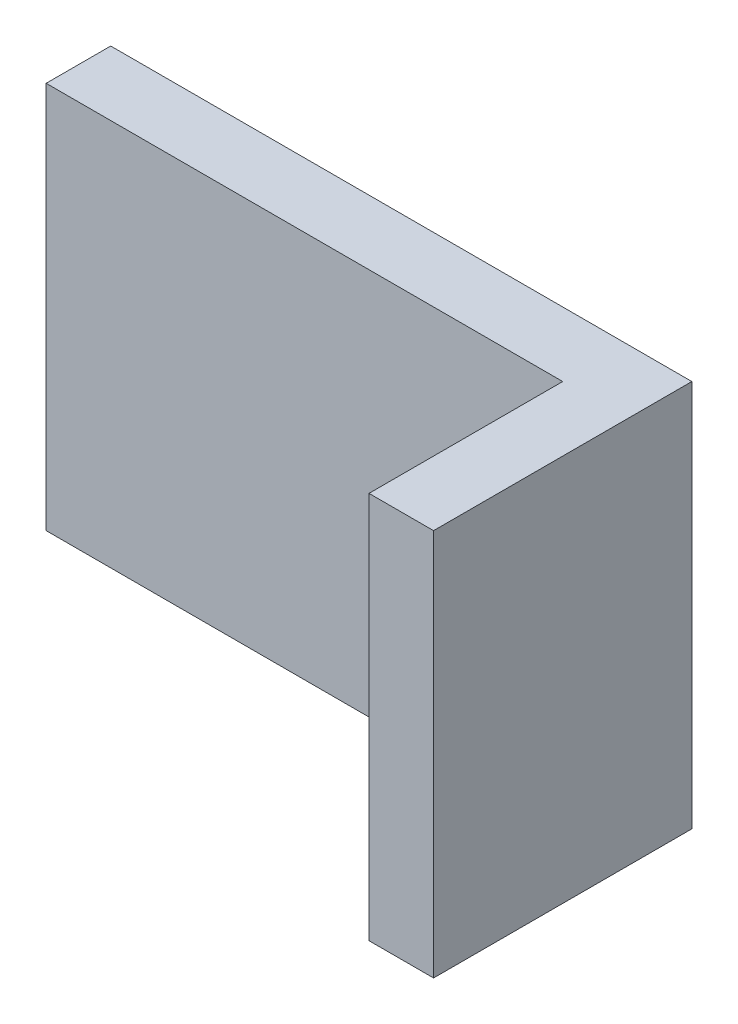
ISO-10303-21;
HEADER;
FILE_DESCRIPTION(('STEP AP214'),'2;1');
FILE_NAME('part.step','',(''),(''),'','','');
FILE_SCHEMA(('AUTOMOTIVE_DESIGN { 1 0 10303 214 1 1 1 1 }'));
ENDSEC;
DATA;
#1=APPLICATION_CONTEXT('core data for automotive mechanical design processes');
#2=APPLICATION_PROTOCOL_DEFINITION('international standard','automotive_design',2000,#1);
#3=PRODUCT_CONTEXT('',#1,'mechanical');
#4=PRODUCT('Part','Part','',(#3));
#5=PRODUCT_RELATED_PRODUCT_CATEGORY('part','',(#4));
#6=PRODUCT_DEFINITION_FORMATION('','',#4);
#7=PRODUCT_DEFINITION_CONTEXT('part definition',#1,'design');
#8=PRODUCT_DEFINITION('design','',#6,#7);
#9=PRODUCT_DEFINITION_SHAPE('','',#8);
#10=(LENGTH_UNIT() NAMED_UNIT(*) SI_UNIT(.MILLI.,.METRE.));
#11=(NAMED_UNIT(*) PLANE_ANGLE_UNIT() SI_UNIT($,.RADIAN.));
#12=(NAMED_UNIT(*) SI_UNIT($,.STERADIAN.) SOLID_ANGLE_UNIT());
#13=UNCERTAINTY_MEASURE_WITH_UNIT(LENGTH_MEASURE(1.E-05),#10,'distance_accuracy_value','');
#14=(GEOMETRIC_REPRESENTATION_CONTEXT(3) GLOBAL_UNCERTAINTY_ASSIGNED_CONTEXT((#13)) GLOBAL_UNIT_ASSIGNED_CONTEXT((#10,
#11,#12)) REPRESENTATION_CONTEXT('',''));
#15=CARTESIAN_POINT('',(0.,0.,0.));
#16=DIRECTION('',(0.,0.,1.));
#17=DIRECTION('',(1.,0.,0.));
#18=AXIS2_PLACEMENT_3D('',#15,#16,#17);
#19=CARTESIAN_POINT('',(0.,3000.,500.));
#20=DIRECTION('',(0.,1.,0.));
#21=DIRECTION('',(0.,0.,1.));
#22=AXIS2_PLACEMENT_3D('',#19,#20,#21);
#23=PLANE('',#22);
#24=DIRECTION('',(1.,0.,0.));
#25=VECTOR('',#24,1.);
#26=CARTESIAN_POINT('',(0.,3000.,0.));
#27=LINE('',#26,#25);
#28=CARTESIAN_POINT('',(0.,3000.,0.));
#29=VERTEX_POINT('',#28);
#30=CARTESIAN_POINT('',(4500.,3000.,0.));
#31=VERTEX_POINT('',#30);
#32=EDGE_CURVE('E106',#29,#31,#27,.T.);
#33=ORIENTED_EDGE('',*,*,#32,.F.);
#34=DIRECTION('',(0.,0.,-1.));
#35=VECTOR('',#34,1.);
#36=CARTESIAN_POINT('',(0.,3000.,500.));
#37=LINE('',#36,#35);
#38=CARTESIAN_POINT('',(0.,3000.,500.));
#39=VERTEX_POINT('',#38);
#40=EDGE_CURVE('E11',#39,#29,#37,.T.);
#41=ORIENTED_EDGE('',*,*,#40,.F.);
#42=DIRECTION('',(1.,0.,0.));
#43=VECTOR('',#42,1.);
#44=CARTESIAN_POINT('',(0.,3000.,500.));
#45=LINE('',#44,#43);
#46=CARTESIAN_POINT('',(4000.,3000.,500.));
#47=VERTEX_POINT('',#46);
#48=EDGE_CURVE('E90',#39,#47,#45,.T.);
#49=ORIENTED_EDGE('',*,*,#48,.T.);
#50=DIRECTION('',(0.,0.,1.));
#51=VECTOR('',#50,1.);
#52=CARTESIAN_POINT('',(4000.,3000.,0.));
#53=LINE('',#52,#51);
#54=CARTESIAN_POINT('',(4000.,3000.,2000.));
#55=VERTEX_POINT('',#54);
#56=EDGE_CURVE('E78',#47,#55,#53,.T.);
#57=ORIENTED_EDGE('',*,*,#56,.T.);
#58=DIRECTION('',(-1.,0.,0.));
#59=VECTOR('',#58,1.);
#60=CARTESIAN_POINT('',(4500.,3000.,2000.));
#61=LINE('',#60,#59);
#62=CARTESIAN_POINT('',(4500.,3000.,2000.));
#63=VERTEX_POINT('',#62);
#64=EDGE_CURVE('E100',#63,#55,#61,.T.);
#65=ORIENTED_EDGE('',*,*,#64,.F.);
#66=DIRECTION('',(0.,0.,1.));
#67=VECTOR('',#66,1.);
#68=CARTESIAN_POINT('',(4500.,3000.,0.));
#69=LINE('',#68,#67);
#70=EDGE_CURVE('E131',#31,#63,#69,.T.);
#71=ORIENTED_EDGE('',*,*,#70,.F.);
#72=EDGE_LOOP('',(#33,#41,#49,#57,#65,#71));
#73=FACE_BOUND('',#72,.T.);
#74=ADVANCED_FACE('F35',(#73),#23,.T.);
#75=CARTESIAN_POINT('',(0.,0.,500.));
#76=DIRECTION('',(-1.,0.,0.));
#77=DIRECTION('',(0.,0.,1.));
#78=AXIS2_PLACEMENT_3D('',#75,#76,#77);
#79=PLANE('',#78);
#80=DIRECTION('',(0.,1.,0.));
#81=VECTOR('',#80,1.);
#82=CARTESIAN_POINT('',(0.,0.,0.));
#83=LINE('',#82,#81);
#84=CARTESIAN_POINT('',(0.,0.,0.));
#85=VERTEX_POINT('',#84);
#86=EDGE_CURVE('E94',#85,#29,#83,.T.);
#87=ORIENTED_EDGE('',*,*,#86,.F.);
#88=DIRECTION('',(0.,0.,-1.));
#89=VECTOR('',#88,1.);
#90=CARTESIAN_POINT('',(0.,0.,500.));
#91=LINE('',#90,#89);
#92=CARTESIAN_POINT('',(0.,0.,500.));
#93=VERTEX_POINT('',#92);
#94=EDGE_CURVE('E38',#93,#85,#91,.T.);
#95=ORIENTED_EDGE('',*,*,#94,.F.);
#96=DIRECTION('',(0.,1.,0.));
#97=VECTOR('',#96,1.);
#98=CARTESIAN_POINT('',(0.,0.,500.));
#99=LINE('',#98,#97);
#100=EDGE_CURVE('E104',#93,#39,#99,.T.);
#101=ORIENTED_EDGE('',*,*,#100,.T.);
#102=ORIENTED_EDGE('',*,*,#40,.T.);
#103=EDGE_LOOP('',(#87,#95,#101,#102));
#104=FACE_BOUND('',#103,.T.);
#105=ADVANCED_FACE('F145',(#104),#79,.T.);
#106=CARTESIAN_POINT('',(0.,0.,500.));
#107=DIRECTION('',(0.,1.,0.));
#108=DIRECTION('',(0.,0.,1.));
#109=AXIS2_PLACEMENT_3D('',#106,#107,#108);
#110=PLANE('',#109);
#111=DIRECTION('',(1.,0.,0.));
#112=VECTOR('',#111,1.);
#113=CARTESIAN_POINT('',(0.,0.,0.));
#114=LINE('',#113,#112);
#115=CARTESIAN_POINT('',(4500.,0.,0.));
#116=VERTEX_POINT('',#115);
#117=EDGE_CURVE('E97',#85,#116,#114,.T.);
#118=ORIENTED_EDGE('',*,*,#117,.T.);
#119=DIRECTION('',(0.,0.,-1.));
#120=VECTOR('',#119,1.);
#121=CARTESIAN_POINT('',(4500.,0.,0.));
#122=LINE('',#121,#120);
#123=CARTESIAN_POINT('',(4500.,-2.44929359829471E-13,2000.));
#124=VERTEX_POINT('',#123);
#125=EDGE_CURVE('E113',#124,#116,#122,.T.);
#126=ORIENTED_EDGE('',*,*,#125,.F.);
#127=DIRECTION('',(-1.,0.,0.));
#128=VECTOR('',#127,1.);
#129=CARTESIAN_POINT('',(4500.,-2.44929359829471E-13,2000.));
#130=LINE('',#129,#128);
#131=CARTESIAN_POINT('',(4000.,-2.44929359829471E-13,2000.));
#132=VERTEX_POINT('',#131);
#133=EDGE_CURVE('E127',#124,#132,#130,.T.);
#134=ORIENTED_EDGE('',*,*,#133,.T.);
#135=DIRECTION('',(0.,0.,-1.));
#136=VECTOR('',#135,1.);
#137=CARTESIAN_POINT('',(4000.,0.,0.));
#138=LINE('',#137,#136);
#139=CARTESIAN_POINT('',(4000.,0.,500.));
#140=VERTEX_POINT('',#139);
#141=EDGE_CURVE('E132',#132,#140,#138,.T.);
#142=ORIENTED_EDGE('',*,*,#141,.T.);
#143=DIRECTION('',(1.,0.,0.));
#144=VECTOR('',#143,1.);
#145=CARTESIAN_POINT('',(0.,0.,500.));
#146=LINE('',#145,#144);
#147=EDGE_CURVE('E92',#93,#140,#146,.T.);
#148=ORIENTED_EDGE('',*,*,#147,.F.);
#149=ORIENTED_EDGE('',*,*,#94,.T.);
#150=EDGE_LOOP('',(#118,#126,#134,#142,#148,#149));
#151=FACE_BOUND('',#150,.T.);
#152=ADVANCED_FACE('F111',(#151),#110,.F.);
#153=CARTESIAN_POINT('',(0.,0.,500.));
#154=DIRECTION('',(0.,0.,1.));
#155=DIRECTION('',(1.,0.,0.));
#156=AXIS2_PLACEMENT_3D('',#153,#154,#155);
#157=PLANE('',#156);
#158=ORIENTED_EDGE('',*,*,#48,.F.);
#159=ORIENTED_EDGE('',*,*,#100,.F.);
#160=ORIENTED_EDGE('',*,*,#147,.T.);
#161=DIRECTION('',(0.,1.,0.));
#162=VECTOR('',#161,1.);
#163=CARTESIAN_POINT('',(4000.,0.,500.));
#164=LINE('',#163,#162);
#165=EDGE_CURVE('E69',#140,#47,#164,.T.);
#166=ORIENTED_EDGE('',*,*,#165,.T.);
#167=EDGE_LOOP('',(#158,#159,#160,#166));
#168=FACE_BOUND('',#167,.T.);
#169=ADVANCED_FACE('F88',(#168),#157,.T.);
#170=CARTESIAN_POINT('',(0.,0.,0.));
#171=DIRECTION('',(0.,0.,1.));
#172=DIRECTION('',(1.,0.,0.));
#173=AXIS2_PLACEMENT_3D('',#170,#171,#172);
#174=PLANE('',#173);
#175=ORIENTED_EDGE('',*,*,#32,.T.);
#176=DIRECTION('',(0.,1.,0.));
#177=VECTOR('',#176,1.);
#178=CARTESIAN_POINT('',(4500.,0.,0.));
#179=LINE('',#178,#177);
#180=EDGE_CURVE('E123',#116,#31,#179,.T.);
#181=ORIENTED_EDGE('',*,*,#180,.F.);
#182=ORIENTED_EDGE('',*,*,#117,.F.);
#183=ORIENTED_EDGE('',*,*,#86,.T.);
#184=EDGE_LOOP('',(#175,#181,#182,#183));
#185=FACE_BOUND('',#184,.T.);
#186=ADVANCED_FACE('F129',(#185),#174,.F.);
#187=CARTESIAN_POINT('',(4500.,-2.44929359829471E-13,2000.));
#188=DIRECTION('',(0.,0.,-1.));
#189=DIRECTION('',(-1.,0.,0.));
#190=AXIS2_PLACEMENT_3D('',#187,#188,#189);
#191=PLANE('',#190);
#192=DIRECTION('',(0.,-1.,0.));
#193=VECTOR('',#192,1.);
#194=CARTESIAN_POINT('',(4000.,-2.44929359829471E-13,2000.));
#195=LINE('',#194,#193);
#196=EDGE_CURVE('E82',#55,#132,#195,.T.);
#197=ORIENTED_EDGE('',*,*,#196,.T.);
#198=ORIENTED_EDGE('',*,*,#133,.F.);
#199=DIRECTION('',(0.,-1.,0.));
#200=VECTOR('',#199,1.);
#201=CARTESIAN_POINT('',(4500.,-2.44929359829471E-13,2000.));
#202=LINE('',#201,#200);
#203=EDGE_CURVE('E125',#63,#124,#202,.T.);
#204=ORIENTED_EDGE('',*,*,#203,.F.);
#205=ORIENTED_EDGE('',*,*,#64,.T.);
#206=EDGE_LOOP('',(#197,#198,#204,#205));
#207=FACE_BOUND('',#206,.T.);
#208=ADVANCED_FACE('F139',(#207),#191,.F.);
#209=CARTESIAN_POINT('',(4500.,0.,0.));
#210=DIRECTION('',(1.,0.,0.));
#211=DIRECTION('',(0.,0.,-1.));
#212=AXIS2_PLACEMENT_3D('',#209,#210,#211);
#213=PLANE('',#212);
#214=ORIENTED_EDGE('',*,*,#180,.T.);
#215=ORIENTED_EDGE('',*,*,#70,.T.);
#216=ORIENTED_EDGE('',*,*,#203,.T.);
#217=ORIENTED_EDGE('',*,*,#125,.T.);
#218=EDGE_LOOP('',(#214,#215,#216,#217));
#219=FACE_BOUND('',#218,.T.);
#220=ADVANCED_FACE('F120',(#219),#213,.T.);
#221=CARTESIAN_POINT('',(4000.,0.,0.));
#222=DIRECTION('',(1.,0.,0.));
#223=DIRECTION('',(0.,0.,-1.));
#224=AXIS2_PLACEMENT_3D('',#221,#222,#223);
#225=PLANE('',#224);
#226=ORIENTED_EDGE('',*,*,#165,.F.);
#227=ORIENTED_EDGE('',*,*,#141,.F.);
#228=ORIENTED_EDGE('',*,*,#196,.F.);
#229=ORIENTED_EDGE('',*,*,#56,.F.);
#230=EDGE_LOOP('',(#226,#227,#228,#229));
#231=FACE_BOUND('',#230,.T.);
#232=ADVANCED_FACE('F79',(#231),#225,.F.);
#233=CLOSED_SHELL('',(#74,#105,#152,#169,#186,#208,#220,#232));
#234=MANIFOLD_SOLID_BREP('B2',#233);
#235=ADVANCED_BREP_SHAPE_REPRESENTATION('',(#18,#234),#14);
#236=SHAPE_DEFINITION_REPRESENTATION(#9,#235);
ENDSEC;
END-ISO-10303-21;
